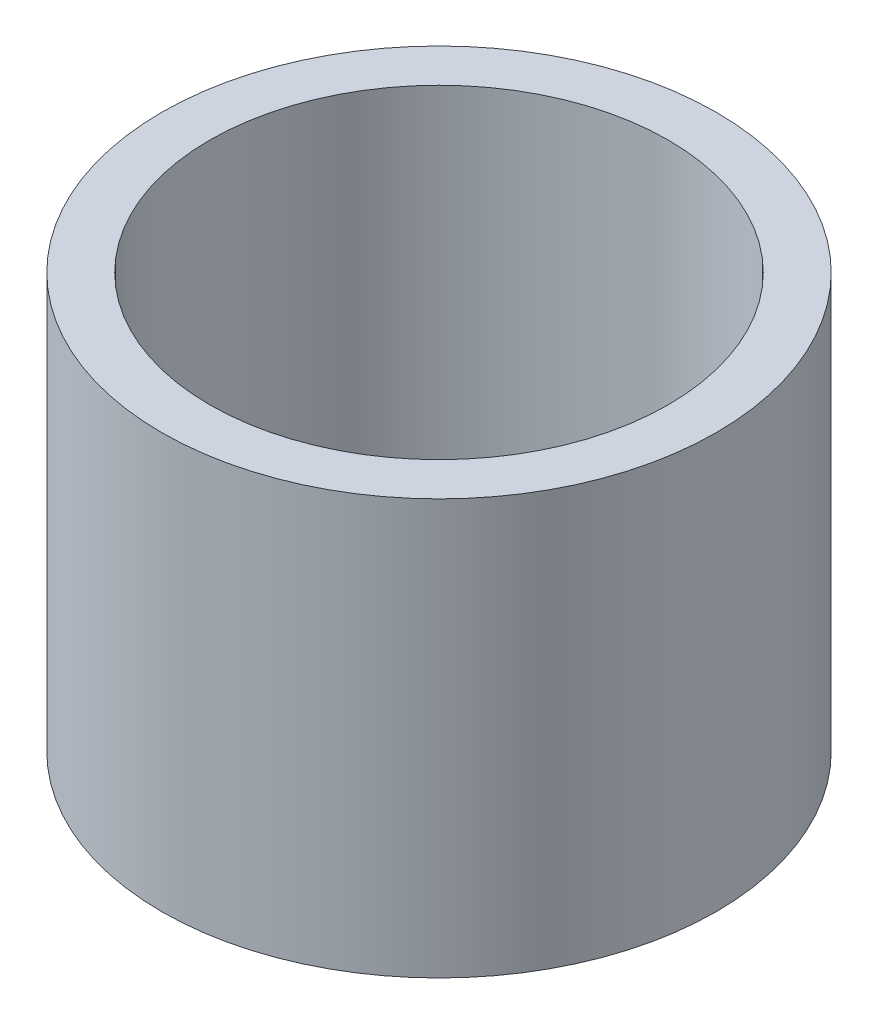
ISO-10303-21;
HEADER;
FILE_DESCRIPTION(('STEP AP214'),'2;1');
FILE_NAME('part.step','',(''),(''),'','','');
FILE_SCHEMA(('AUTOMOTIVE_DESIGN { 1 0 10303 214 1 1 1 1 }'));
ENDSEC;
DATA;
#1=APPLICATION_CONTEXT('core data for automotive mechanical design processes');
#2=APPLICATION_PROTOCOL_DEFINITION('international standard','automotive_design',2000,#1);
#3=PRODUCT_CONTEXT('',#1,'mechanical');
#4=PRODUCT('Part','Part','',(#3));
#5=PRODUCT_RELATED_PRODUCT_CATEGORY('part','',(#4));
#6=PRODUCT_DEFINITION_FORMATION('','',#4);
#7=PRODUCT_DEFINITION_CONTEXT('part definition',#1,'design');
#8=PRODUCT_DEFINITION('design','',#6,#7);
#9=PRODUCT_DEFINITION_SHAPE('','',#8);
#10=(LENGTH_UNIT() NAMED_UNIT(*) SI_UNIT(.MILLI.,.METRE.));
#11=(NAMED_UNIT(*) PLANE_ANGLE_UNIT() SI_UNIT($,.RADIAN.));
#12=(NAMED_UNIT(*) SI_UNIT($,.STERADIAN.) SOLID_ANGLE_UNIT());
#13=UNCERTAINTY_MEASURE_WITH_UNIT(LENGTH_MEASURE(1.E-05),#10,'distance_accuracy_value','');
#14=(GEOMETRIC_REPRESENTATION_CONTEXT(3) GLOBAL_UNCERTAINTY_ASSIGNED_CONTEXT((#13)) GLOBAL_UNIT_ASSIGNED_CONTEXT((#10,
#11,#12)) REPRESENTATION_CONTEXT('',''));
#15=CARTESIAN_POINT('',(0.,0.,0.));
#16=DIRECTION('',(0.,0.,1.));
#17=DIRECTION('',(1.,0.,0.));
#18=AXIS2_PLACEMENT_3D('',#15,#16,#17);
#19=CARTESIAN_POINT('',(0.,9.5,0.));
#20=DIRECTION('',(0.,1.,0.));
#21=DIRECTION('',(0.,0.,1.));
#22=AXIS2_PLACEMENT_3D('',#19,#20,#21);
#23=PLANE('',#22);
#24=CARTESIAN_POINT('',(0.,9.5,0.));
#25=DIRECTION('',(0.,1.,0.));
#26=DIRECTION('',(0.,0.,1.));
#27=AXIS2_PLACEMENT_3D('',#24,#25,#26);
#28=CIRCLE('',#27,6.35);
#29=CARTESIAN_POINT('',(0.,9.5,6.35));
#30=VERTEX_POINT('',#29);
#31=EDGE_CURVE('E10',#30,#30,#28,.T.);
#32=ORIENTED_EDGE('',*,*,#31,.T.);
#33=EDGE_LOOP('',(#32));
#34=FACE_BOUND('',#33,.T.);
#35=CARTESIAN_POINT('',(0.,9.5,0.));
#36=DIRECTION('',(0.,1.,0.));
#37=DIRECTION('',(0.,0.,1.));
#38=AXIS2_PLACEMENT_3D('',#35,#36,#37);
#39=CIRCLE('',#38,5.25);
#40=CARTESIAN_POINT('',(0.,9.5,5.25));
#41=VERTEX_POINT('',#40);
#42=EDGE_CURVE('E44',#41,#41,#39,.T.);
#43=ORIENTED_EDGE('',*,*,#42,.F.);
#44=EDGE_LOOP('',(#43));
#45=FACE_BOUND('',#44,.T.);
#46=ADVANCED_FACE('F33',(#34,#45),#23,.T.);
#47=CARTESIAN_POINT('',(0.,0.,0.));
#48=DIRECTION('',(0.,1.,0.));
#49=DIRECTION('',(0.,0.,1.));
#50=AXIS2_PLACEMENT_3D('',#47,#48,#49);
#51=PLANE('',#50);
#52=CARTESIAN_POINT('',(0.,0.,0.));
#53=DIRECTION('',(0.,1.,0.));
#54=DIRECTION('',(0.,0.,1.));
#55=AXIS2_PLACEMENT_3D('',#52,#53,#54);
#56=CIRCLE('',#55,6.35);
#57=CARTESIAN_POINT('',(0.,0.,6.35));
#58=VERTEX_POINT('',#57);
#59=EDGE_CURVE('E37',#58,#58,#56,.T.);
#60=ORIENTED_EDGE('',*,*,#59,.F.);
#61=EDGE_LOOP('',(#60));
#62=FACE_BOUND('',#61,.T.);
#63=CARTESIAN_POINT('',(0.,0.,0.));
#64=DIRECTION('',(0.,1.,0.));
#65=DIRECTION('',(0.,0.,1.));
#66=AXIS2_PLACEMENT_3D('',#63,#64,#65);
#67=CIRCLE('',#66,5.25);
#68=CARTESIAN_POINT('',(0.,0.,5.25));
#69=VERTEX_POINT('',#68);
#70=EDGE_CURVE('E46',#69,#69,#67,.T.);
#71=ORIENTED_EDGE('',*,*,#70,.T.);
#72=EDGE_LOOP('',(#71));
#73=FACE_BOUND('',#72,.T.);
#74=ADVANCED_FACE('F56',(#62,#73),#51,.F.);
#75=CARTESIAN_POINT('',(0.,9.5,0.));
#76=DIRECTION('',(0.,-1.,0.));
#77=DIRECTION('',(0.,0.,-1.));
#78=AXIS2_PLACEMENT_3D('',#75,#76,#77);
#79=CYLINDRICAL_SURFACE('',#78,6.35);
#80=ORIENTED_EDGE('',*,*,#31,.F.);
#81=EDGE_LOOP('',(#80));
#82=FACE_BOUND('',#81,.T.);
#83=ORIENTED_EDGE('',*,*,#59,.T.);
#84=EDGE_LOOP('',(#83));
#85=FACE_BOUND('',#84,.T.);
#86=ADVANCED_FACE('F35',(#82,#85),#79,.T.);
#87=CARTESIAN_POINT('',(0.,9.5,0.));
#88=DIRECTION('',(0.,-1.,0.));
#89=DIRECTION('',(0.,0.,-1.));
#90=AXIS2_PLACEMENT_3D('',#87,#88,#89);
#91=CYLINDRICAL_SURFACE('',#90,5.25);
#92=ORIENTED_EDGE('',*,*,#42,.T.);
#93=EDGE_LOOP('',(#92));
#94=FACE_BOUND('',#93,.T.);
#95=ORIENTED_EDGE('',*,*,#70,.F.);
#96=EDGE_LOOP('',(#95));
#97=FACE_BOUND('',#96,.T.);
#98=ADVANCED_FACE('F52',(#94,#97),#91,.F.);
#99=CLOSED_SHELL('',(#46,#74,#86,#98));
#100=MANIFOLD_SOLID_BREP('B2',#99);
#101=ADVANCED_BREP_SHAPE_REPRESENTATION('',(#18,#100),#14);
#102=SHAPE_DEFINITION_REPRESENTATION(#9,#101);
ENDSEC;
END-ISO-10303-21;
